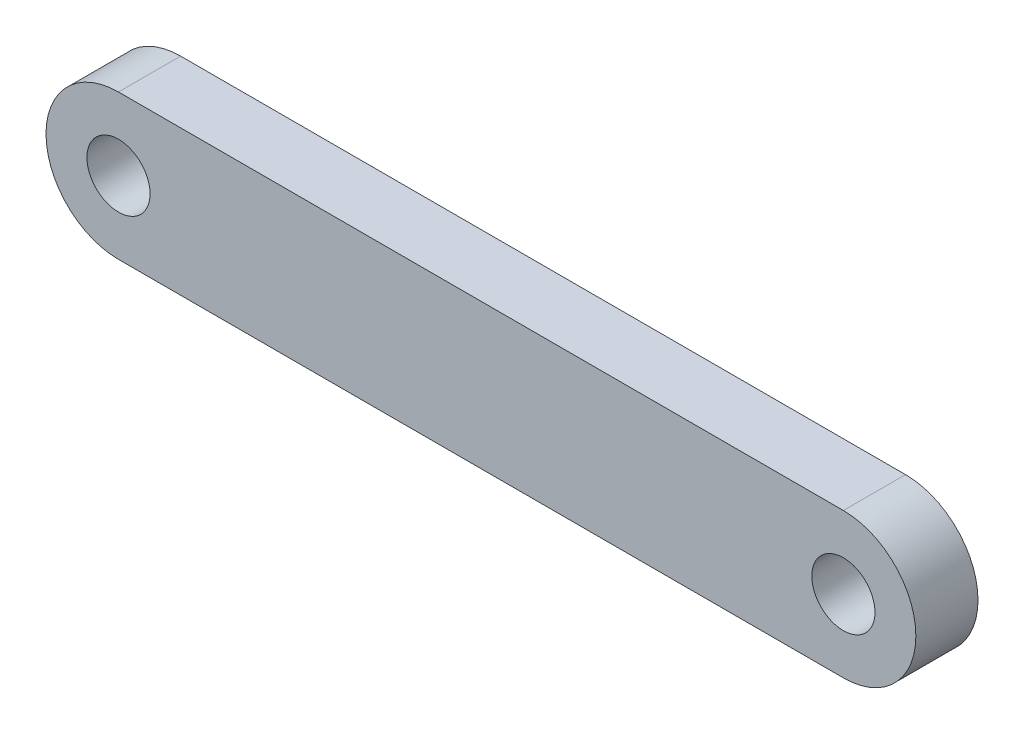
ISO-10303-21;
HEADER;
FILE_DESCRIPTION(('STEP AP214'),'2;1');
FILE_NAME('part.step','',(''),(''),'','','');
FILE_SCHEMA(('AUTOMOTIVE_DESIGN { 1 0 10303 214 1 1 1 1 }'));
ENDSEC;
DATA;
#1=APPLICATION_CONTEXT('core data for automotive mechanical design processes');
#2=APPLICATION_PROTOCOL_DEFINITION('international standard','automotive_design',2000,#1);
#3=PRODUCT_CONTEXT('',#1,'mechanical');
#4=PRODUCT('Part','Part','',(#3));
#5=PRODUCT_RELATED_PRODUCT_CATEGORY('part','',(#4));
#6=PRODUCT_DEFINITION_FORMATION('','',#4);
#7=PRODUCT_DEFINITION_CONTEXT('part definition',#1,'design');
#8=PRODUCT_DEFINITION('design','',#6,#7);
#9=PRODUCT_DEFINITION_SHAPE('','',#8);
#10=(LENGTH_UNIT() NAMED_UNIT(*) SI_UNIT(.MILLI.,.METRE.));
#11=(NAMED_UNIT(*) PLANE_ANGLE_UNIT() SI_UNIT($,.RADIAN.));
#12=(NAMED_UNIT(*) SI_UNIT($,.STERADIAN.) SOLID_ANGLE_UNIT());
#13=UNCERTAINTY_MEASURE_WITH_UNIT(LENGTH_MEASURE(1.E-05),#10,'distance_accuracy_value','');
#14=(GEOMETRIC_REPRESENTATION_CONTEXT(3) GLOBAL_UNCERTAINTY_ASSIGNED_CONTEXT((#13)) GLOBAL_UNIT_ASSIGNED_CONTEXT((#10,
#11,#12)) REPRESENTATION_CONTEXT('',''));
#15=CARTESIAN_POINT('',(0.,0.,0.));
#16=DIRECTION('',(0.,0.,1.));
#17=DIRECTION('',(1.,0.,0.));
#18=AXIS2_PLACEMENT_3D('',#15,#16,#17);
#19=CARTESIAN_POINT('',(0.,-3.5,1.5));
#20=DIRECTION('',(0.,1.,0.));
#21=DIRECTION('',(-1.,0.,0.));
#22=AXIS2_PLACEMENT_3D('',#19,#20,#21);
#23=PLANE('',#22);
#24=DIRECTION('',(1.,0.,0.));
#25=VECTOR('',#24,1.);
#26=CARTESIAN_POINT('',(0.,-3.5,-1.5));
#27=LINE('',#26,#25);
#28=CARTESIAN_POINT('',(0.,-3.5,-1.5));
#29=VERTEX_POINT('',#28);
#30=CARTESIAN_POINT('',(35.,-3.5,-1.5));
#31=VERTEX_POINT('',#30);
#32=EDGE_CURVE('E105',#29,#31,#27,.T.);
#33=ORIENTED_EDGE('',*,*,#32,.T.);
#34=DIRECTION('',(0.,0.,-1.));
#35=VECTOR('',#34,1.);
#36=CARTESIAN_POINT('',(35.,-3.5,1.5));
#37=LINE('',#36,#35);
#38=CARTESIAN_POINT('',(35.,-3.5,1.5));
#39=VERTEX_POINT('',#38);
#40=EDGE_CURVE('E11',#39,#31,#37,.T.);
#41=ORIENTED_EDGE('',*,*,#40,.F.);
#42=DIRECTION('',(1.,0.,0.));
#43=VECTOR('',#42,1.);
#44=CARTESIAN_POINT('',(0.,-3.5,1.5));
#45=LINE('',#44,#43);
#46=CARTESIAN_POINT('',(0.,-3.5,1.5));
#47=VERTEX_POINT('',#46);
#48=EDGE_CURVE('E84',#47,#39,#45,.T.);
#49=ORIENTED_EDGE('',*,*,#48,.F.);
#50=DIRECTION('',(0.,0.,-1.));
#51=VECTOR('',#50,1.);
#52=CARTESIAN_POINT('',(0.,-3.5,1.5));
#53=LINE('',#52,#51);
#54=EDGE_CURVE('E104',#47,#29,#53,.T.);
#55=ORIENTED_EDGE('',*,*,#54,.T.);
#56=EDGE_LOOP('',(#33,#41,#49,#55));
#57=FACE_BOUND('',#56,.T.);
#58=ADVANCED_FACE('F36',(#57),#23,.F.);
#59=CARTESIAN_POINT('',(35.,0.,1.5));
#60=DIRECTION('',(0.,0.,-1.));
#61=DIRECTION('',(-1.,0.,0.));
#62=AXIS2_PLACEMENT_3D('',#59,#60,#61);
#63=CYLINDRICAL_SURFACE('',#62,3.5);
#64=CARTESIAN_POINT('',(35.,0.,-1.5));
#65=DIRECTION('',(0.,0.,1.));
#66=DIRECTION('',(1.,0.,0.));
#67=AXIS2_PLACEMENT_3D('',#64,#65,#66);
#68=CIRCLE('',#67,3.5);
#69=CARTESIAN_POINT('',(35.,3.5,-1.5));
#70=VERTEX_POINT('',#69);
#71=EDGE_CURVE('E89',#31,#70,#68,.T.);
#72=ORIENTED_EDGE('',*,*,#71,.T.);
#73=DIRECTION('',(0.,0.,-1.));
#74=VECTOR('',#73,1.);
#75=CARTESIAN_POINT('',(35.,3.5,1.5));
#76=LINE('',#75,#74);
#77=CARTESIAN_POINT('',(35.,3.5,1.5));
#78=VERTEX_POINT('',#77);
#79=EDGE_CURVE('E44',#78,#70,#76,.T.);
#80=ORIENTED_EDGE('',*,*,#79,.F.);
#81=CARTESIAN_POINT('',(35.,0.,1.5));
#82=DIRECTION('',(0.,0.,1.));
#83=DIRECTION('',(1.,0.,0.));
#84=AXIS2_PLACEMENT_3D('',#81,#82,#83);
#85=CIRCLE('',#84,3.5);
#86=EDGE_CURVE('E78',#39,#78,#85,.T.);
#87=ORIENTED_EDGE('',*,*,#86,.F.);
#88=ORIENTED_EDGE('',*,*,#40,.T.);
#89=EDGE_LOOP('',(#72,#80,#87,#88));
#90=FACE_BOUND('',#89,.T.);
#91=ADVANCED_FACE('F88',(#90),#63,.T.);
#92=CARTESIAN_POINT('',(0.,3.5,1.5));
#93=DIRECTION('',(0.,1.,0.));
#94=DIRECTION('',(-1.,0.,0.));
#95=AXIS2_PLACEMENT_3D('',#92,#93,#94);
#96=PLANE('',#95);
#97=DIRECTION('',(1.,0.,0.));
#98=VECTOR('',#97,1.);
#99=CARTESIAN_POINT('',(0.,3.5,-1.5));
#100=LINE('',#99,#98);
#101=CARTESIAN_POINT('',(0.,3.5,-1.5));
#102=VERTEX_POINT('',#101);
#103=EDGE_CURVE('E109',#102,#70,#100,.T.);
#104=ORIENTED_EDGE('',*,*,#103,.F.);
#105=DIRECTION('',(0.,0.,-1.));
#106=VECTOR('',#105,1.);
#107=CARTESIAN_POINT('',(0.,3.5,1.5));
#108=LINE('',#107,#106);
#109=CARTESIAN_POINT('',(0.,3.5,1.5));
#110=VERTEX_POINT('',#109);
#111=EDGE_CURVE('E68',#110,#102,#108,.T.);
#112=ORIENTED_EDGE('',*,*,#111,.F.);
#113=DIRECTION('',(1.,0.,0.));
#114=VECTOR('',#113,1.);
#115=CARTESIAN_POINT('',(0.,3.5,1.5));
#116=LINE('',#115,#114);
#117=EDGE_CURVE('E82',#110,#78,#116,.T.);
#118=ORIENTED_EDGE('',*,*,#117,.T.);
#119=ORIENTED_EDGE('',*,*,#79,.T.);
#120=EDGE_LOOP('',(#104,#112,#118,#119));
#121=FACE_BOUND('',#120,.T.);
#122=ADVANCED_FACE('F93',(#121),#96,.T.);
#123=CARTESIAN_POINT('',(0.,0.,1.5));
#124=DIRECTION('',(0.,0.,-1.));
#125=DIRECTION('',(-1.,0.,0.));
#126=AXIS2_PLACEMENT_3D('',#123,#124,#125);
#127=CYLINDRICAL_SURFACE('',#126,1.525);
#128=CARTESIAN_POINT('',(0.,0.,1.5));
#129=DIRECTION('',(0.,0.,1.));
#130=DIRECTION('',(1.,0.,0.));
#131=AXIS2_PLACEMENT_3D('',#128,#129,#130);
#132=CIRCLE('',#131,1.525);
#133=CARTESIAN_POINT('',(1.525,0.,1.5));
#134=VERTEX_POINT('',#133);
#135=EDGE_CURVE('E95',#134,#134,#132,.T.);
#136=ORIENTED_EDGE('',*,*,#135,.T.);
#137=EDGE_LOOP('',(#136));
#138=FACE_BOUND('',#137,.T.);
#139=CARTESIAN_POINT('',(0.,0.,-1.5));
#140=DIRECTION('',(0.,0.,1.));
#141=DIRECTION('',(1.,0.,0.));
#142=AXIS2_PLACEMENT_3D('',#139,#140,#141);
#143=CIRCLE('',#142,1.525);
#144=CARTESIAN_POINT('',(1.525,0.,-1.5));
#145=VERTEX_POINT('',#144);
#146=EDGE_CURVE('E112',#145,#145,#143,.T.);
#147=ORIENTED_EDGE('',*,*,#146,.F.);
#148=EDGE_LOOP('',(#147));
#149=FACE_BOUND('',#148,.T.);
#150=ADVANCED_FACE('F140',(#138,#149),#127,.F.);
#151=CARTESIAN_POINT('',(0.,0.,1.5));
#152=DIRECTION('',(0.,0.,-1.));
#153=DIRECTION('',(-1.,0.,0.));
#154=AXIS2_PLACEMENT_3D('',#151,#152,#153);
#155=CYLINDRICAL_SURFACE('',#154,3.5);
#156=CARTESIAN_POINT('',(0.,0.,-1.5));
#157=DIRECTION('',(0.,0.,1.));
#158=DIRECTION('',(1.,0.,0.));
#159=AXIS2_PLACEMENT_3D('',#156,#157,#158);
#160=CIRCLE('',#159,3.5);
#161=EDGE_CURVE('E71',#102,#29,#160,.T.);
#162=ORIENTED_EDGE('',*,*,#161,.T.);
#163=ORIENTED_EDGE('',*,*,#54,.F.);
#164=CARTESIAN_POINT('',(0.,0.,1.5));
#165=DIRECTION('',(0.,0.,1.));
#166=DIRECTION('',(1.,0.,0.));
#167=AXIS2_PLACEMENT_3D('',#164,#165,#166);
#168=CIRCLE('',#167,3.5);
#169=EDGE_CURVE('E52',#110,#47,#168,.T.);
#170=ORIENTED_EDGE('',*,*,#169,.F.);
#171=ORIENTED_EDGE('',*,*,#111,.T.);
#172=EDGE_LOOP('',(#162,#163,#170,#171));
#173=FACE_BOUND('',#172,.T.);
#174=ADVANCED_FACE('F132',(#173),#155,.T.);
#175=CARTESIAN_POINT('',(35.,0.,1.5));
#176=DIRECTION('',(0.,0.,-1.));
#177=DIRECTION('',(-1.,0.,0.));
#178=AXIS2_PLACEMENT_3D('',#175,#176,#177);
#179=CYLINDRICAL_SURFACE('',#178,1.525);
#180=CARTESIAN_POINT('',(35.,0.,1.5));
#181=DIRECTION('',(0.,0.,1.));
#182=DIRECTION('',(1.,0.,0.));
#183=AXIS2_PLACEMENT_3D('',#180,#181,#182);
#184=CIRCLE('',#183,1.525);
#185=CARTESIAN_POINT('',(36.525,0.,1.5));
#186=VERTEX_POINT('',#185);
#187=EDGE_CURVE('E101',#186,#186,#184,.F.);
#188=ORIENTED_EDGE('',*,*,#187,.F.);
#189=EDGE_LOOP('',(#188));
#190=FACE_BOUND('',#189,.T.);
#191=CARTESIAN_POINT('',(35.,0.,-1.5));
#192=DIRECTION('',(0.,0.,1.));
#193=DIRECTION('',(1.,0.,0.));
#194=AXIS2_PLACEMENT_3D('',#191,#192,#193);
#195=CIRCLE('',#194,1.525);
#196=CARTESIAN_POINT('',(36.525,0.,-1.5));
#197=VERTEX_POINT('',#196);
#198=EDGE_CURVE('E115',#197,#197,#195,.F.);
#199=ORIENTED_EDGE('',*,*,#198,.T.);
#200=EDGE_LOOP('',(#199));
#201=FACE_BOUND('',#200,.T.);
#202=ADVANCED_FACE('F130',(#190,#201),#179,.F.);
#203=CARTESIAN_POINT('',(0.,0.,1.5));
#204=DIRECTION('',(0.,0.,1.));
#205=DIRECTION('',(1.,0.,0.));
#206=AXIS2_PLACEMENT_3D('',#203,#204,#205);
#207=PLANE('',#206);
#208=ORIENTED_EDGE('',*,*,#48,.T.);
#209=ORIENTED_EDGE('',*,*,#86,.T.);
#210=ORIENTED_EDGE('',*,*,#117,.F.);
#211=ORIENTED_EDGE('',*,*,#169,.T.);
#212=EDGE_LOOP('',(#208,#209,#210,#211));
#213=FACE_BOUND('',#212,.T.);
#214=ORIENTED_EDGE('',*,*,#135,.F.);
#215=EDGE_LOOP('',(#214));
#216=FACE_BOUND('',#215,.T.);
#217=ORIENTED_EDGE('',*,*,#187,.T.);
#218=EDGE_LOOP('',(#217));
#219=FACE_BOUND('',#218,.T.);
#220=ADVANCED_FACE('F79',(#213,#216,#219),#207,.T.);
#221=CARTESIAN_POINT('',(0.,0.,-1.5));
#222=DIRECTION('',(0.,0.,1.));
#223=DIRECTION('',(1.,0.,0.));
#224=AXIS2_PLACEMENT_3D('',#221,#222,#223);
#225=PLANE('',#224);
#226=ORIENTED_EDGE('',*,*,#32,.F.);
#227=ORIENTED_EDGE('',*,*,#161,.F.);
#228=ORIENTED_EDGE('',*,*,#103,.T.);
#229=ORIENTED_EDGE('',*,*,#71,.F.);
#230=EDGE_LOOP('',(#226,#227,#228,#229));
#231=FACE_BOUND('',#230,.T.);
#232=ORIENTED_EDGE('',*,*,#146,.T.);
#233=EDGE_LOOP('',(#232));
#234=FACE_BOUND('',#233,.T.);
#235=ORIENTED_EDGE('',*,*,#198,.F.);
#236=EDGE_LOOP('',(#235));
#237=FACE_BOUND('',#236,.T.);
#238=ADVANCED_FACE('F122',(#231,#234,#237),#225,.F.);
#239=CLOSED_SHELL('',(#58,#91,#122,#150,#174,#202,#220,#238));
#240=MANIFOLD_SOLID_BREP('B2',#239);
#241=ADVANCED_BREP_SHAPE_REPRESENTATION('',(#18,#240),#14);
#242=SHAPE_DEFINITION_REPRESENTATION(#9,#241);
ENDSEC;
END-ISO-10303-21;
